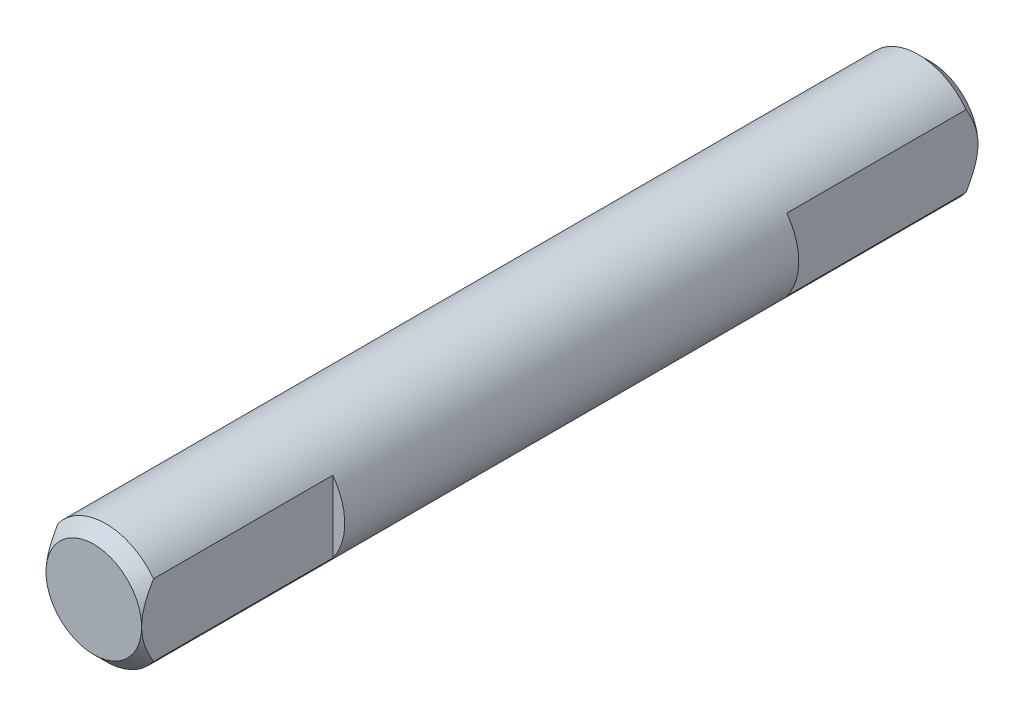
ISO-10303-21;
HEADER;
FILE_DESCRIPTION(('STEP AP214'),'2;1');
FILE_NAME('part.step','',(''),(''),'','','');
FILE_SCHEMA(('AUTOMOTIVE_DESIGN { 1 0 10303 214 1 1 1 1 }'));
ENDSEC;
DATA;
#1=APPLICATION_CONTEXT('core data for automotive mechanical design processes');
#2=APPLICATION_PROTOCOL_DEFINITION('international standard','automotive_design',2000,#1);
#3=PRODUCT_CONTEXT('',#1,'mechanical');
#4=PRODUCT('Part','Part','',(#3));
#5=PRODUCT_RELATED_PRODUCT_CATEGORY('part','',(#4));
#6=PRODUCT_DEFINITION_FORMATION('','',#4);
#7=PRODUCT_DEFINITION_CONTEXT('part definition',#1,'design');
#8=PRODUCT_DEFINITION('design','',#6,#7);
#9=PRODUCT_DEFINITION_SHAPE('','',#8);
#10=(LENGTH_UNIT() NAMED_UNIT(*) SI_UNIT(.MILLI.,.METRE.));
#11=(NAMED_UNIT(*) PLANE_ANGLE_UNIT() SI_UNIT($,.RADIAN.));
#12=(NAMED_UNIT(*) SI_UNIT($,.STERADIAN.) SOLID_ANGLE_UNIT());
#13=UNCERTAINTY_MEASURE_WITH_UNIT(LENGTH_MEASURE(1.E-05),#10,'distance_accuracy_value','');
#14=(GEOMETRIC_REPRESENTATION_CONTEXT(3) GLOBAL_UNCERTAINTY_ASSIGNED_CONTEXT((#13)) GLOBAL_UNIT_ASSIGNED_CONTEXT((#10,
#11,#12)) REPRESENTATION_CONTEXT('',''));
#15=CARTESIAN_POINT('',(0.,0.,0.));
#16=DIRECTION('',(0.,0.,1.));
#17=DIRECTION('',(1.,0.,0.));
#18=AXIS2_PLACEMENT_3D('',#15,#16,#17);
#19=CARTESIAN_POINT('',(0.,0.,35.));
#20=DIRECTION('',(0.,0.,-1.));
#21=DIRECTION('',(-1.,0.,0.));
#22=AXIS2_PLACEMENT_3D('',#19,#20,#21);
#23=CYLINDRICAL_SURFACE('',#22,2.5);
#24=CARTESIAN_POINT('',(0.,0.,34.5));
#25=DIRECTION('',(0.,0.,1.));
#26=DIRECTION('',(1.,0.,0.));
#27=AXIS2_PLACEMENT_3D('',#24,#25,#26);
#28=CIRCLE('',#27,2.5);
#29=CARTESIAN_POINT('',(-2.,1.5,34.5));
#30=VERTEX_POINT('',#29);
#31=CARTESIAN_POINT('',(2.,1.5,34.5));
#32=VERTEX_POINT('',#31);
#33=EDGE_CURVE('E256',#30,#32,#28,.F.);
#34=ORIENTED_EDGE('',*,*,#33,.T.);
#35=DIRECTION('',(0.,0.,-1.));
#36=VECTOR('',#35,1.);
#37=CARTESIAN_POINT('',(2.,1.5,35.));
#38=LINE('',#37,#36);
#39=CARTESIAN_POINT('',(2.,1.5,27.));
#40=VERTEX_POINT('',#39);
#41=EDGE_CURVE('E241',#32,#40,#38,.T.);
#42=ORIENTED_EDGE('',*,*,#41,.T.);
#43=CARTESIAN_POINT('',(0.,0.,27.));
#44=DIRECTION('',(0.,0.,-1.));
#45=DIRECTION('',(-1.,0.,0.));
#46=AXIS2_PLACEMENT_3D('',#43,#44,#45);
#47=CIRCLE('',#46,2.5);
#48=CARTESIAN_POINT('',(2.,-1.5,27.));
#49=VERTEX_POINT('',#48);
#50=EDGE_CURVE('E130',#40,#49,#47,.T.);
#51=ORIENTED_EDGE('',*,*,#50,.T.);
#52=DIRECTION('',(0.,0.,-1.));
#53=VECTOR('',#52,1.);
#54=CARTESIAN_POINT('',(2.,-1.5,35.));
#55=LINE('',#54,#53);
#56=CARTESIAN_POINT('',(2.,-1.5,34.5));
#57=VERTEX_POINT('',#56);
#58=EDGE_CURVE('E270',#49,#57,#55,.F.);
#59=ORIENTED_EDGE('',*,*,#58,.T.);
#60=CARTESIAN_POINT('',(-2.,-1.5,34.5));
#61=VERTEX_POINT('',#60);
#62=EDGE_CURVE('E253',#57,#61,#28,.F.);
#63=ORIENTED_EDGE('',*,*,#62,.T.);
#64=DIRECTION('',(0.,0.,-1.));
#65=VECTOR('',#64,1.);
#66=CARTESIAN_POINT('',(-2.,-1.5,35.));
#67=LINE('',#66,#65);
#68=CARTESIAN_POINT('',(-2.,-1.5,27.));
#69=VERTEX_POINT('',#68);
#70=EDGE_CURVE('E265',#61,#69,#67,.T.);
#71=ORIENTED_EDGE('',*,*,#70,.T.);
#72=CARTESIAN_POINT('',(0.,0.,27.));
#73=DIRECTION('',(0.,0.,1.));
#74=DIRECTION('',(1.,0.,0.));
#75=AXIS2_PLACEMENT_3D('',#72,#73,#74);
#76=CIRCLE('',#75,2.5);
#77=CARTESIAN_POINT('',(-2.,1.5,27.));
#78=VERTEX_POINT('',#77);
#79=EDGE_CURVE('E247',#78,#69,#76,.T.);
#80=ORIENTED_EDGE('',*,*,#79,.F.);
#81=DIRECTION('',(0.,0.,-1.));
#82=VECTOR('',#81,1.);
#83=CARTESIAN_POINT('',(-2.,1.5,35.));
#84=LINE('',#83,#82);
#85=EDGE_CURVE('E259',#78,#30,#84,.F.);
#86=ORIENTED_EDGE('',*,*,#85,.T.);
#87=EDGE_LOOP('',(#34,#42,#51,#59,#63,#71,#80,#86));
#88=FACE_BOUND('',#87,.T.);
#89=DIRECTION('',(0.,0.,-1.));
#90=VECTOR('',#89,1.);
#91=CARTESIAN_POINT('',(2.,-1.5,35.));
#92=LINE('',#91,#90);
#93=CARTESIAN_POINT('',(2.,-1.5,8.));
#94=VERTEX_POINT('',#93);
#95=CARTESIAN_POINT('',(2.,-1.5,0.5));
#96=VERTEX_POINT('',#95);
#97=EDGE_CURVE('E59',#94,#96,#92,.T.);
#98=ORIENTED_EDGE('',*,*,#97,.F.);
#99=CARTESIAN_POINT('',(0.,0.,8.));
#100=DIRECTION('',(0.,0.,1.));
#101=DIRECTION('',(1.,0.,0.));
#102=AXIS2_PLACEMENT_3D('',#99,#100,#101);
#103=CIRCLE('',#102,2.5);
#104=CARTESIAN_POINT('',(2.,1.5,8.));
#105=VERTEX_POINT('',#104);
#106=EDGE_CURVE('E11',#94,#105,#103,.T.);
#107=ORIENTED_EDGE('',*,*,#106,.T.);
#108=DIRECTION('',(0.,0.,-1.));
#109=VECTOR('',#108,1.);
#110=CARTESIAN_POINT('',(2.,1.5,35.));
#111=LINE('',#110,#109);
#112=CARTESIAN_POINT('',(2.,1.5,0.5));
#113=VERTEX_POINT('',#112);
#114=EDGE_CURVE('E286',#113,#105,#111,.F.);
#115=ORIENTED_EDGE('',*,*,#114,.F.);
#116=CARTESIAN_POINT('',(0.,0.,0.5));
#117=DIRECTION('',(0.,0.,1.));
#118=DIRECTION('',(1.,0.,0.));
#119=AXIS2_PLACEMENT_3D('',#116,#117,#118);
#120=CIRCLE('',#119,2.5);
#121=CARTESIAN_POINT('',(-2.,1.5,0.5));
#122=VERTEX_POINT('',#121);
#123=EDGE_CURVE('E149',#113,#122,#120,.T.);
#124=ORIENTED_EDGE('',*,*,#123,.T.);
#125=DIRECTION('',(0.,0.,-1.));
#126=VECTOR('',#125,1.);
#127=CARTESIAN_POINT('',(-2.,1.5,35.));
#128=LINE('',#127,#126);
#129=CARTESIAN_POINT('',(-2.,1.5,8.00000000000001));
#130=VERTEX_POINT('',#129);
#131=EDGE_CURVE('E67',#130,#122,#128,.T.);
#132=ORIENTED_EDGE('',*,*,#131,.F.);
#133=CARTESIAN_POINT('',(0.,0.,8.00000000000001));
#134=DIRECTION('',(0.,0.,-1.));
#135=DIRECTION('',(-1.,0.,0.));
#136=AXIS2_PLACEMENT_3D('',#133,#134,#135);
#137=CIRCLE('',#136,2.5);
#138=CARTESIAN_POINT('',(-2.,-1.5,8.00000000000001));
#139=VERTEX_POINT('',#138);
#140=EDGE_CURVE('E52',#139,#130,#137,.T.);
#141=ORIENTED_EDGE('',*,*,#140,.F.);
#142=DIRECTION('',(0.,0.,-1.));
#143=VECTOR('',#142,1.);
#144=CARTESIAN_POINT('',(-2.,-1.5,35.));
#145=LINE('',#144,#143);
#146=CARTESIAN_POINT('',(-2.,-1.5,0.5));
#147=VERTEX_POINT('',#146);
#148=EDGE_CURVE('E293',#147,#139,#145,.F.);
#149=ORIENTED_EDGE('',*,*,#148,.F.);
#150=EDGE_CURVE('E139',#147,#96,#120,.T.);
#151=ORIENTED_EDGE('',*,*,#150,.T.);
#152=EDGE_LOOP('',(#98,#107,#115,#124,#132,#141,#149,#151));
#153=FACE_BOUND('',#152,.T.);
#154=ADVANCED_FACE('F41',(#88,#153),#23,.T.);
#155=CARTESIAN_POINT('',(0.,0.,0.5));
#156=DIRECTION('',(0.,0.,1.));
#157=DIRECTION('',(1.,0.,0.));
#158=AXIS2_PLACEMENT_3D('',#155,#156,#157);
#159=CONICAL_SURFACE('',#158,2.5,0.78539816339745);
#160=ORIENTED_EDGE('',*,*,#123,.F.);
#161=CARTESIAN_POINT('',(2.,4.70733260334106,3.11458505046867));
#162=CARTESIAN_POINT('',(2.,4.56765633851216,2.98606868600203));
#163=CARTESIAN_POINT('',(2.,4.42757690484636,2.85798377123656));
#164=CARTESIAN_POINT('',(2.,4.14626179218968,2.6030262124796));
#165=CARTESIAN_POINT('',(2.,4.00502585629595,2.47615385219663));
#166=CARTESIAN_POINT('',(2.,3.72024074410302,2.22325670914494));
#167=CARTESIAN_POINT('',(2.,3.5766826930685,2.09724189685756));
#168=CARTESIAN_POINT('',(2.,3.2876237827933,1.84748612790184));
#169=CARTESIAN_POINT('',(2.,3.14212315821885,1.72374490079594));
#170=CARTESIAN_POINT('',(2.,2.87541951246266,1.50194473941931));
#171=CARTESIAN_POINT('',(2.,2.7546665538689,1.40334608469604));
#172=CARTESIAN_POINT('',(2.,2.5107812138698,1.20913757810508));
#173=CARTESIAN_POINT('',(2.,2.38764902812163,1.11352748214988));
#174=CARTESIAN_POINT('',(2.,2.13828133077954,0.926674966919423));
#175=CARTESIAN_POINT('',(2.,2.01204889232086,0.835428467272768));
#176=CARTESIAN_POINT('',(2.,1.75521275694857,0.65931997030913));
#177=CARTESIAN_POINT('',(2.,1.62461146080164,0.574454547118741));
#178=CARTESIAN_POINT('',(2.,1.42478099127702,0.455038928042071));
#179=CARTESIAN_POINT('',(2.,1.35782206346063,0.416700559448546));
#180=CARTESIAN_POINT('',(2.,1.22219748415621,0.343183984293799));
#181=CARTESIAN_POINT('',(2.,1.15353226000204,0.308004996463979));
#182=CARTESIAN_POINT('',(2.,1.01433128796129,0.241679866989011));
#183=CARTESIAN_POINT('',(2.,0.94379709422244,0.210530493914011));
#184=CARTESIAN_POINT('',(2.,0.800682336121673,0.153321987505701));
#185=CARTESIAN_POINT('',(2.,0.728102372303708,0.127261377792704));
#186=CARTESIAN_POINT('',(2.,0.596625866914442,0.0863691186601699));
#187=CARTESIAN_POINT('',(2.,0.53810762757219,0.0703280445681481));
#188=CARTESIAN_POINT('',(2.,0.420010861816682,0.0428205106292761));
#189=CARTESIAN_POINT('',(2.,0.360432708997187,0.0313524710103287));
#190=CARTESIAN_POINT('',(2.,0.2406727801969,0.013561343550777));
#191=CARTESIAN_POINT('',(2.,0.180493164630591,0.00722392253696024));
#192=CARTESIAN_POINT('',(2.,0.0598045119102166,-1.25513709071584E-05));
#193=CARTESIAN_POINT('',(2.,-0.000704513150542348,-0.000911802581740898));
#194=CARTESIAN_POINT('',(2.,-0.12161273889781,0.00278155370624693));
#195=CARTESIAN_POINT('',(2.,-0.182011768594845,0.00737966956486273));
#196=CARTESIAN_POINT('',(2.,-0.302181632573437,0.0218191650052441));
#197=CARTESIAN_POINT('',(2.,-0.361952339006533,0.0316615913959607));
#198=CARTESIAN_POINT('',(2.,-0.480679035525496,0.0561284694837315));
#199=CARTESIAN_POINT('',(2.,-0.539632078312704,0.0707670384292919));
#200=CARTESIAN_POINT('',(2.,-0.656331276144349,0.104197433836032));
#201=CARTESIAN_POINT('',(2.,-0.714077416632477,0.122989310358166));
#202=CARTESIAN_POINT('',(2.,-0.906324430916522,0.192141780557365));
#203=CARTESIAN_POINT('',(2.,-1.03792580460996,0.25056171854498));
#204=CARTESIAN_POINT('',(2.,-1.29483732764872,0.379965644401734));
#205=CARTESIAN_POINT('',(2.,-1.42013296272368,0.450977056029693));
#206=CARTESIAN_POINT('',(2.,-1.66723061798334,0.601924422629116));
#207=CARTESIAN_POINT('',(2.,-1.78897282166976,0.681957080371664));
#208=CARTESIAN_POINT('',(2.,-2.02854158468645,0.847366224214051));
#209=CARTESIAN_POINT('',(2.,-2.14637186137293,0.932737401067285));
#210=CARTESIAN_POINT('',(2.,-2.37274672327691,1.10236096326613));
#211=CARTESIAN_POINT('',(2.,-2.48144337967512,1.18641173372975));
#212=CARTESIAN_POINT('',(2.,-2.69692128751157,1.35694066579446));
#213=CARTESIAN_POINT('',(2.,-2.80370238589713,1.44341901995557));
#214=CARTESIAN_POINT('',(2.,-3.01584325679499,1.61824590362354));
#215=CARTESIAN_POINT('',(2.,-3.12120198346214,1.70659569831334));
#216=CARTESIAN_POINT('',(2.,-3.33073897034599,1.8846849624911));
#217=CARTESIAN_POINT('',(2.,-3.43491720975857,1.97442445640444));
#218=CARTESIAN_POINT('',(2.,-3.63743889300396,2.15073491407193));
#219=CARTESIAN_POINT('',(2.,-3.7358259321047,2.23725588581223));
#220=CARTESIAN_POINT('',(2.,-3.93189567773272,2.41109393862329));
#221=CARTESIAN_POINT('',(2.,-4.02957837541264,2.49841102966317));
#222=CARTESIAN_POINT('',(2.,-4.22421976777858,2.67356715369778));
#223=CARTESIAN_POINT('',(2.,-4.32117930214648,2.76140525460758));
#224=CARTESIAN_POINT('',(2.,-4.51460358612084,2.93761836874425));
#225=CARTESIAN_POINT('',(2.,-4.61106835190253,3.02599336420968));
#226=CARTESIAN_POINT('',(2.,-4.70733260334106,3.11458505046867));
#227=B_SPLINE_CURVE_WITH_KNOTS('',3,(#161,#162,#163,#164,#165,#166,#167,#168,#169,#170,#171,
#172,#173,#174,#175,#176,#177,#178,#179,#180,#181,#182,#183,#184,#185,#186,#187,#188,#189,#190,
#191,#192,#193,#194,#195,#196,#197,#198,#199,#200,#201,#202,#203,#204,#205,#206,#207,#208,#209,
#210,#211,#212,#213,#214,#215,#216,#217,#218,#219,#220,#221,#222,#223,#224,#225,#226),
.UNSPECIFIED.,.F.,.F.,(4,2,2,2,2,2,2,2,2,2,2,2,2,2,2,2,2,2,2,2,2,2,2,2,2,2,2,2,2,2,2,2,4),(0.,
0.569420844434676,1.13897180917573,1.71201586574736,2.28499131295323,2.75264217508894,
3.22025474198279,3.68742113675619,4.15433490125256,4.38574501848536,4.61709775290638,
4.84826379537268,5.07936267071599,5.26123760911258,5.44304966357884,5.62435202816021,
5.80564778104686,5.98712534456105,6.16863914611713,6.35069209947591,6.53274724728849,
6.96347783440279,7.39515832484498,7.83200905240167,8.26843202907216,8.68059475365626,
9.09279026458087,9.50527394347325,9.91776488043138,10.3108157304498,10.7038715090838,
11.0963615782175,11.4888387330146),.UNSPECIFIED.);
#228=CARTESIAN_POINT('',(2.,0.,0.));
#229=VERTEX_POINT('',#228);
#230=EDGE_CURVE('E146',#113,#229,#227,.T.);
#231=ORIENTED_EDGE('',*,*,#230,.T.);
#232=CARTESIAN_POINT('',(0.,0.,0.));
#233=DIRECTION('',(0.,0.,1.));
#234=DIRECTION('',(1.,0.,0.));
#235=AXIS2_PLACEMENT_3D('',#232,#233,#234);
#236=CIRCLE('',#235,2.);
#237=CARTESIAN_POINT('',(-2.,0.,0.));
#238=VERTEX_POINT('',#237);
#239=EDGE_CURVE('E144',#238,#229,#236,.F.);
#240=ORIENTED_EDGE('',*,*,#239,.F.);
#241=CARTESIAN_POINT('',(-2.,-4.70733260334106,3.11458505046867));
#242=CARTESIAN_POINT('',(-2.,-4.56765633851216,2.98606868600203));
#243=CARTESIAN_POINT('',(-2.,-4.42757690484636,2.85798377123656));
#244=CARTESIAN_POINT('',(-2.,-4.14626179218968,2.6030262124796));
#245=CARTESIAN_POINT('',(-2.,-4.00502585629595,2.47615385219664));
#246=CARTESIAN_POINT('',(-2.,-3.72024074410302,2.22325670914494));
#247=CARTESIAN_POINT('',(-2.,-3.5766826930685,2.09724189685756));
#248=CARTESIAN_POINT('',(-2.,-3.2876237827933,1.84748612790185));
#249=CARTESIAN_POINT('',(-2.,-3.14212315821885,1.72374490079594));
#250=CARTESIAN_POINT('',(-2.,-2.87541951246266,1.50194473941931));
#251=CARTESIAN_POINT('',(-2.,-2.7546665538689,1.40334608469604));
#252=CARTESIAN_POINT('',(-2.,-2.5107812138698,1.20913757810508));
#253=CARTESIAN_POINT('',(-2.,-2.38764902812163,1.11352748214988));
#254=CARTESIAN_POINT('',(-2.,-2.13828133077953,0.926674966919422));
#255=CARTESIAN_POINT('',(-2.,-2.01204889232085,0.835428467272767));
#256=CARTESIAN_POINT('',(-2.,-1.75521275694857,0.659319970309129));
#257=CARTESIAN_POINT('',(-2.,-1.62461146080164,0.57445454711874));
#258=CARTESIAN_POINT('',(-2.,-1.42478099127702,0.45503892804207));
#259=CARTESIAN_POINT('',(-2.,-1.35782206346063,0.416700559448545));
#260=CARTESIAN_POINT('',(-2.,-1.22219748415621,0.343183984293798));
#261=CARTESIAN_POINT('',(-2.,-1.15353226000204,0.308004996463978));
#262=CARTESIAN_POINT('',(-2.,-1.01433128796129,0.24167986698901));
#263=CARTESIAN_POINT('',(-2.,-0.943797094222437,0.21053049391401));
#264=CARTESIAN_POINT('',(-2.,-0.80068233612167,0.153321987505701));
#265=CARTESIAN_POINT('',(-2.,-0.728102372303705,0.127261377792703));
#266=CARTESIAN_POINT('',(-2.,-0.596625866914439,0.0863691186601694));
#267=CARTESIAN_POINT('',(-2.,-0.538107627572187,0.0703280445681479));
#268=CARTESIAN_POINT('',(-2.,-0.420010861816679,0.0428205106292759));
#269=CARTESIAN_POINT('',(-2.,-0.360432708997184,0.0313524710103284));
#270=CARTESIAN_POINT('',(-2.,-0.240672780196898,0.0135613435507768));
#271=CARTESIAN_POINT('',(-2.,-0.180493164630589,0.00722392253696026));
#272=CARTESIAN_POINT('',(-2.,-0.0598045119102139,-1.25513709070229E-05));
#273=CARTESIAN_POINT('',(-2.,0.000704513150545025,-0.000911802581740874));
#274=CARTESIAN_POINT('',(-2.,0.121612738897812,0.00278155370624683));
#275=CARTESIAN_POINT('',(-2.,0.182011768594847,0.00737966956486258));
#276=CARTESIAN_POINT('',(-2.,0.302181632573439,0.0218191650052441));
#277=CARTESIAN_POINT('',(-2.,0.361952339006535,0.0316615913959609));
#278=CARTESIAN_POINT('',(-2.,0.480679035525498,0.0561284694837318));
#279=CARTESIAN_POINT('',(-2.,0.539632078312707,0.070767038429292));
#280=CARTESIAN_POINT('',(-2.,0.656331276144351,0.104197433836032));
#281=CARTESIAN_POINT('',(-2.,0.714077416632479,0.122989310358167));
#282=CARTESIAN_POINT('',(-2.,0.906324430916525,0.192141780557365));
#283=CARTESIAN_POINT('',(-2.,1.03792580460996,0.250561718544981));
#284=CARTESIAN_POINT('',(-2.,1.29483732764872,0.379965644401735));
#285=CARTESIAN_POINT('',(-2.,1.42013296272368,0.450977056029694));
#286=CARTESIAN_POINT('',(-2.,1.66723061798334,0.601924422629118));
#287=CARTESIAN_POINT('',(-2.,1.78897282166976,0.681957080371667));
#288=CARTESIAN_POINT('',(-2.,2.02854158468645,0.847366224214054));
#289=CARTESIAN_POINT('',(-2.,2.14637186137294,0.932737401067287));
#290=CARTESIAN_POINT('',(-2.,2.37274672327692,1.10236096326614));
#291=CARTESIAN_POINT('',(-2.,2.48144337967513,1.18641173372975));
#292=CARTESIAN_POINT('',(-2.,2.69692128751157,1.35694066579446));
#293=CARTESIAN_POINT('',(-2.,2.80370238589714,1.44341901995557));
#294=CARTESIAN_POINT('',(-2.,3.015843256795,1.61824590362354));
#295=CARTESIAN_POINT('',(-2.,3.12120198346215,1.70659569831334));
#296=CARTESIAN_POINT('',(-2.,3.330738970346,1.8846849624911));
#297=CARTESIAN_POINT('',(-2.,3.43491720975857,1.97442445640445));
#298=CARTESIAN_POINT('',(-2.,3.63743889300396,2.15073491407193));
#299=CARTESIAN_POINT('',(-2.,3.7358259321047,2.23725588581223));
#300=CARTESIAN_POINT('',(-2.,3.93189567773272,2.41109393862329));
#301=CARTESIAN_POINT('',(-2.,4.02957837541264,2.49841102966317));
#302=CARTESIAN_POINT('',(-2.,4.22421976777858,2.67356715369778));
#303=CARTESIAN_POINT('',(-2.,4.32117930214648,2.76140525460758));
#304=CARTESIAN_POINT('',(-2.,4.51460358612084,2.93761836874425));
#305=CARTESIAN_POINT('',(-2.,4.61106835190253,3.02599336420968));
#306=CARTESIAN_POINT('',(-2.,4.70733260334106,3.11458505046867));
#307=B_SPLINE_CURVE_WITH_KNOTS('',3,(#241,#242,#243,#244,#245,#246,#247,#248,#249,#250,#251,
#252,#253,#254,#255,#256,#257,#258,#259,#260,#261,#262,#263,#264,#265,#266,#267,#268,#269,#270,
#271,#272,#273,#274,#275,#276,#277,#278,#279,#280,#281,#282,#283,#284,#285,#286,#287,#288,#289,
#290,#291,#292,#293,#294,#295,#296,#297,#298,#299,#300,#301,#302,#303,#304,#305,#306),
.UNSPECIFIED.,.F.,.F.,(4,2,2,2,2,2,2,2,2,2,2,2,2,2,2,2,2,2,2,2,2,2,2,2,2,2,2,2,2,2,2,2,4),(0.,
0.569420844434675,1.13897180917573,1.71201586574736,2.28499131295323,2.75264217508894,
3.22025474198279,3.6874211367562,4.15433490125257,4.38574501848537,4.61709775290638,
4.84826379537268,5.07936267071599,5.26123760911258,5.44304966357884,5.62435202816021,
5.80564778104686,5.98712534456105,6.16863914611713,6.35069209947591,6.53274724728849,
6.9634778344028,7.39515832484498,7.83200905240167,8.26843202907217,8.68059475365626,
9.09279026458087,9.50527394347325,9.91776488043139,10.3108157304498,10.7038715090838,
11.0963615782175,11.4888387330146),.UNSPECIFIED.);
#308=EDGE_CURVE('E120',#238,#122,#307,.T.);
#309=ORIENTED_EDGE('',*,*,#308,.T.);
#310=EDGE_LOOP('',(#160,#231,#240,#309));
#311=FACE_BOUND('',#310,.T.);
#312=ADVANCED_FACE('F145',(#311),#159,.T.);
#313=EDGE_CURVE('E137',#229,#238,#236,.F.);
#314=ORIENTED_EDGE('',*,*,#313,.F.);
#315=EDGE_CURVE('E141',#229,#96,#227,.T.);
#316=ORIENTED_EDGE('',*,*,#315,.T.);
#317=ORIENTED_EDGE('',*,*,#150,.F.);
#318=EDGE_CURVE('E123',#147,#238,#307,.T.);
#319=ORIENTED_EDGE('',*,*,#318,.T.);
#320=EDGE_LOOP('',(#314,#316,#317,#319));
#321=FACE_BOUND('',#320,.T.);
#322=ADVANCED_FACE('F135',(#321),#159,.T.);
#323=CARTESIAN_POINT('',(0.,0.,35.));
#324=DIRECTION('',(0.,0.,-1.));
#325=DIRECTION('',(-1.,0.,0.));
#326=AXIS2_PLACEMENT_3D('',#323,#324,#325);
#327=CONICAL_SURFACE('',#326,2.00000000000001,0.785398163397446);
#328=CARTESIAN_POINT('',(2.,4.70733260334106,31.8854149495313));
#329=CARTESIAN_POINT('',(2.,4.56765633851216,32.013931313998));
#330=CARTESIAN_POINT('',(2.,4.42757690484636,32.1420162287634));
#331=CARTESIAN_POINT('',(2.,4.14626179218968,32.3969737875204));
#332=CARTESIAN_POINT('',(2.,4.00502585629595,32.5238461478034));
#333=CARTESIAN_POINT('',(2.,3.72024074410302,32.7767432908551));
#334=CARTESIAN_POINT('',(2.,3.5766826930685,32.9027581031424));
#335=CARTESIAN_POINT('',(2.,3.2876237827933,33.1525138720982));
#336=CARTESIAN_POINT('',(2.,3.14212315821886,33.2762550992041));
#337=CARTESIAN_POINT('',(2.,2.87541951246267,33.4980552605807));
#338=CARTESIAN_POINT('',(2.,2.75466655386891,33.596653915304));
#339=CARTESIAN_POINT('',(2.,2.51078121386981,33.7908624218949));
#340=CARTESIAN_POINT('',(2.,2.38764902812164,33.8864725178501));
#341=CARTESIAN_POINT('',(2.,2.13828133077955,34.0733250330806));
#342=CARTESIAN_POINT('',(2.,2.01204889232088,34.1645715327272));
#343=CARTESIAN_POINT('',(2.,1.7552127569486,34.3406800296909));
#344=CARTESIAN_POINT('',(2.,1.62461146080167,34.4255454528812));
#345=CARTESIAN_POINT('',(2.,1.42478099127705,34.5449610719579));
#346=CARTESIAN_POINT('',(2.,1.35782206346066,34.5832994405514));
#347=CARTESIAN_POINT('',(2.,1.22219748415624,34.6568160157062));
#348=CARTESIAN_POINT('',(2.,1.15353226000207,34.691995003536));
#349=CARTESIAN_POINT('',(2.,1.01433128796132,34.758320133011));
#350=CARTESIAN_POINT('',(2.,0.943797094222464,34.789469506086));
#351=CARTESIAN_POINT('',(2.,0.800682336121697,34.8466780124943));
#352=CARTESIAN_POINT('',(2.,0.728102372303732,34.8727386222073));
#353=CARTESIAN_POINT('',(2.,0.596625866914466,34.9136308813398));
#354=CARTESIAN_POINT('',(2.,0.538107627572214,34.9296719554319));
#355=CARTESIAN_POINT('',(2.,0.420010861816706,34.9571794893707));
#356=CARTESIAN_POINT('',(2.,0.360432708997211,34.9686475289897));
#357=CARTESIAN_POINT('',(2.,0.240672780196924,34.9864386564492));
#358=CARTESIAN_POINT('',(2.,0.180493164630615,34.9927760774631));
#359=CARTESIAN_POINT('',(2.,0.0598045119102405,35.0000125513709));
#360=CARTESIAN_POINT('',(2.,-0.000704513150518109,35.0009118025818));
#361=CARTESIAN_POINT('',(2.,-0.121612738897786,34.9972184462938));
#362=CARTESIAN_POINT('',(2.,-0.182011768594822,34.9926203304352));
#363=CARTESIAN_POINT('',(2.,-0.302181632573415,34.9781808349948));
#364=CARTESIAN_POINT('',(2.,-0.36195233900651,34.9683384086041));
#365=CARTESIAN_POINT('',(2.,-0.480679035525474,34.9438715305163));
#366=CARTESIAN_POINT('',(2.,-0.539632078312683,34.9292329615707));
#367=CARTESIAN_POINT('',(2.,-0.656331276144328,34.895802566164));
#368=CARTESIAN_POINT('',(2.,-0.714077416632455,34.8770106896419));
#369=CARTESIAN_POINT('',(2.,-0.906324430916494,34.8078582194427));
#370=CARTESIAN_POINT('',(2.,-1.03792580460993,34.749438281455));
#371=CARTESIAN_POINT('',(2.,-1.29483732764867,34.6200343555983));
#372=CARTESIAN_POINT('',(2.,-1.42013296272363,34.5490229439703));
#373=CARTESIAN_POINT('',(2.,-1.66723061798329,34.3980755773709));
#374=CARTESIAN_POINT('',(2.,-1.7889728216697,34.3180429196284));
#375=CARTESIAN_POINT('',(2.,-2.02854158468638,34.152633775786));
#376=CARTESIAN_POINT('',(2.,-2.14637186137286,34.0672625989328));
#377=CARTESIAN_POINT('',(2.,-2.37274672327684,33.8976390367339));
#378=CARTESIAN_POINT('',(2.,-2.48144337967505,33.8135882662703));
#379=CARTESIAN_POINT('',(2.,-2.69692128751151,33.6430593342056));
#380=CARTESIAN_POINT('',(2.,-2.80370238589707,33.5565809800445));
#381=CARTESIAN_POINT('',(2.,-3.01584325679494,33.3817540963765));
#382=CARTESIAN_POINT('',(2.,-3.1212019834621,33.2934043016867));
#383=CARTESIAN_POINT('',(2.,-3.33073897034595,33.1153150375089));
#384=CARTESIAN_POINT('',(2.,-3.43491720975854,33.0255755435956));
#385=CARTESIAN_POINT('',(2.,-3.63743889300393,32.8492650859281));
#386=CARTESIAN_POINT('',(2.,-3.73582593210468,32.7627441141878));
#387=CARTESIAN_POINT('',(2.,-3.93189567773271,32.5889060613767));
#388=CARTESIAN_POINT('',(2.,-4.02957837541262,32.5015889703368));
#389=CARTESIAN_POINT('',(2.,-4.22421976777856,32.3264328463022));
#390=CARTESIAN_POINT('',(2.,-4.32117930214647,32.2385947453924));
#391=CARTESIAN_POINT('',(2.,-4.51460358612084,32.0623816312557));
#392=CARTESIAN_POINT('',(2.,-4.61106835190253,31.9740066357903));
#393=CARTESIAN_POINT('',(2.,-4.70733260334106,31.8854149495313));
#394=B_SPLINE_CURVE_WITH_KNOTS('',3,(#328,#329,#330,#331,#332,#333,#334,#335,#336,#337,#338,
#339,#340,#341,#342,#343,#344,#345,#346,#347,#348,#349,#350,#351,#352,#353,#354,#355,#356,#357,
#358,#359,#360,#361,#362,#363,#364,#365,#366,#367,#368,#369,#370,#371,#372,#373,#374,#375,#376,
#377,#378,#379,#380,#381,#382,#383,#384,#385,#386,#387,#388,#389,#390,#391,#392,#393),
.UNSPECIFIED.,.F.,.F.,(4,2,2,2,2,2,2,2,2,2,2,2,2,2,2,2,2,2,2,2,2,2,2,2,2,2,2,2,2,2,2,2,4),(0.,
0.569420844434672,1.13897180917573,1.71201586574736,2.28499131295322,2.75264217508893,
3.22025474198277,3.68742113675617,4.15433490125253,4.38574501848534,4.61709775290636,
4.84826379537266,5.07936267071597,5.26123760911256,5.44304966357882,5.62435202816019,
5.80564778104684,5.98712534456103,6.16863914611711,6.35069209947589,6.53274724728847,
6.96347783440276,7.39515832484493,7.8320090524016,8.26843202907208,8.68059475365618,
9.09279026458081,9.50527394347321,9.91776488043136,10.3108157304498,10.7038715090838,
11.0963615782175,11.4888387330146),.UNSPECIFIED.);
#395=CARTESIAN_POINT('',(2.00000000000001,0.,35.));
#396=VERTEX_POINT('',#395);
#397=EDGE_CURVE('E236',#32,#396,#394,.T.);
#398=ORIENTED_EDGE('',*,*,#397,.F.);
#399=ORIENTED_EDGE('',*,*,#33,.F.);
#400=CARTESIAN_POINT('',(-2.,-4.70733260334106,31.8854149495313));
#401=CARTESIAN_POINT('',(-2.,-4.56765633851216,32.013931313998));
#402=CARTESIAN_POINT('',(-2.,-4.42757690484636,32.1420162287634));
#403=CARTESIAN_POINT('',(-2.,-4.14626179218968,32.3969737875204));
#404=CARTESIAN_POINT('',(-2.,-4.00502585629596,32.5238461478034));
#405=CARTESIAN_POINT('',(-2.,-3.72024074410302,32.776743290855));
#406=CARTESIAN_POINT('',(-2.,-3.57668269306851,32.9027581031424));
#407=CARTESIAN_POINT('',(-2.,-3.28762378279331,33.1525138720982));
#408=CARTESIAN_POINT('',(-2.,-3.14212315821886,33.2762550992041));
#409=CARTESIAN_POINT('',(-2.,-2.87541951246268,33.4980552605807));
#410=CARTESIAN_POINT('',(-2.,-2.75466655386892,33.596653915304));
#411=CARTESIAN_POINT('',(-2.,-2.51078121386982,33.7908624218949));
#412=CARTESIAN_POINT('',(-2.,-2.38764902812165,33.8864725178501));
#413=CARTESIAN_POINT('',(-2.,-2.13828133077956,34.0733250330806));
#414=CARTESIAN_POINT('',(-2.,-2.01204889232089,34.1645715327272));
#415=CARTESIAN_POINT('',(-2.,-1.75521275694861,34.3406800296909));
#416=CARTESIAN_POINT('',(-2.,-1.62461146080168,34.4255454528812));
#417=CARTESIAN_POINT('',(-2.,-1.42478099127707,34.5449610719579));
#418=CARTESIAN_POINT('',(-2.,-1.35782206346067,34.5832994405514));
#419=CARTESIAN_POINT('',(-2.,-1.22219748415625,34.6568160157062));
#420=CARTESIAN_POINT('',(-2.,-1.15353226000208,34.691995003536));
#421=CARTESIAN_POINT('',(-2.,-1.01433128796133,34.758320133011));
#422=CARTESIAN_POINT('',(-2.,-0.943797094222476,34.789469506086));
#423=CARTESIAN_POINT('',(-2.,-0.800682336121707,34.8466780124943));
#424=CARTESIAN_POINT('',(-2.,-0.72810237230374,34.8727386222073));
#425=CARTESIAN_POINT('',(-2.,-0.596625866914473,34.9136308813398));
#426=CARTESIAN_POINT('',(-2.,-0.538107627572222,34.9296719554319));
#427=CARTESIAN_POINT('',(-2.,-0.420010861816714,34.9571794893707));
#428=CARTESIAN_POINT('',(-2.,-0.360432708997219,34.9686475289897));
#429=CARTESIAN_POINT('',(-2.,-0.240672780196932,34.9864386564492));
#430=CARTESIAN_POINT('',(-2.,-0.180493164630623,34.9927760774631));
#431=CARTESIAN_POINT('',(-2.,-0.0598045119102487,35.0000125513709));
#432=CARTESIAN_POINT('',(-2.,0.000704513150510093,35.0009118025818));
#433=CARTESIAN_POINT('',(-2.,0.121612738897777,34.9972184462938));
#434=CARTESIAN_POINT('',(-2.,0.182011768594812,34.9926203304352));
#435=CARTESIAN_POINT('',(-2.,0.302181632573405,34.9781808349948));
#436=CARTESIAN_POINT('',(-2.,0.361952339006502,34.9683384086041));
#437=CARTESIAN_POINT('',(-2.,0.480679035525467,34.9438715305163));
#438=CARTESIAN_POINT('',(-2.,0.539632078312675,34.9292329615707));
#439=CARTESIAN_POINT('',(-2.,0.656331276144319,34.895802566164));
#440=CARTESIAN_POINT('',(-2.,0.714077416632447,34.8770106896418));
#441=CARTESIAN_POINT('',(-2.,0.906324430916487,34.8078582194427));
#442=CARTESIAN_POINT('',(-2.,1.03792580460992,34.7494382814551));
#443=CARTESIAN_POINT('',(-2.,1.29483732764866,34.6200343555983));
#444=CARTESIAN_POINT('',(-2.,1.42013296272362,34.5490229439703));
#445=CARTESIAN_POINT('',(-2.,1.66723061798327,34.3980755773709));
#446=CARTESIAN_POINT('',(-2.,1.78897282166969,34.3180429196284));
#447=CARTESIAN_POINT('',(-2.,2.02854158468636,34.152633775786));
#448=CARTESIAN_POINT('',(-2.,2.14637186137284,34.0672625989328));
#449=CARTESIAN_POINT('',(-2.,2.37274672327682,33.8976390367339));
#450=CARTESIAN_POINT('',(-2.,2.48144337967503,33.8135882662703));
#451=CARTESIAN_POINT('',(-2.,2.69692128751149,33.6430593342056));
#452=CARTESIAN_POINT('',(-2.,2.80370238589705,33.5565809800445));
#453=CARTESIAN_POINT('',(-2.,3.01584325679492,33.3817540963765));
#454=CARTESIAN_POINT('',(-2.,3.12120198346208,33.2934043016867));
#455=CARTESIAN_POINT('',(-2.,3.33073897034594,33.1153150375089));
#456=CARTESIAN_POINT('',(-2.,3.43491720975852,33.0255755435956));
#457=CARTESIAN_POINT('',(-2.,3.63743889300392,32.8492650859281));
#458=CARTESIAN_POINT('',(-2.,3.73582593210466,32.7627441141878));
#459=CARTESIAN_POINT('',(-2.,3.93189567773269,32.5889060613767));
#460=CARTESIAN_POINT('',(-2.,4.02957837541261,32.5015889703369));
#461=CARTESIAN_POINT('',(-2.,4.22421976777855,32.3264328463022));
#462=CARTESIAN_POINT('',(-2.,4.32117930214646,32.2385947453924));
#463=CARTESIAN_POINT('',(-2.,4.51460358612083,32.0623816312557));
#464=CARTESIAN_POINT('',(-2.,4.61106835190252,31.9740066357903));
#465=CARTESIAN_POINT('',(-2.,4.70733260334105,31.8854149495313));
#466=B_SPLINE_CURVE_WITH_KNOTS('',3,(#400,#401,#402,#403,#404,#405,#406,#407,#408,#409,#410,
#411,#412,#413,#414,#415,#416,#417,#418,#419,#420,#421,#422,#423,#424,#425,#426,#427,#428,#429,
#430,#431,#432,#433,#434,#435,#436,#437,#438,#439,#440,#441,#442,#443,#444,#445,#446,#447,#448,
#449,#450,#451,#452,#453,#454,#455,#456,#457,#458,#459,#460,#461,#462,#463,#464,#465),
.UNSPECIFIED.,.F.,.F.,(4,2,2,2,2,2,2,2,2,2,2,2,2,2,2,2,2,2,2,2,2,2,2,2,2,2,2,2,2,2,2,2,4),(0.,
0.569420844434677,1.13897180917573,1.71201586574736,2.28499131295322,2.75264217508893,
3.22025474198277,3.68742113675616,4.15433490125253,4.38574501848533,4.61709775290635,
4.84826379537265,5.07936267071597,5.26123760911256,5.44304966357882,5.62435202816019,
5.80564778104684,5.98712534456102,6.16863914611711,6.35069209947589,6.53274724728847,
6.96347783440276,7.39515832484492,7.83200905240159,8.26843202907206,8.68059475365617,
9.0927902645808,9.50527394347319,9.91776488043135,10.3108157304497,10.7038715090838,
11.0963615782175,11.4888387330146),.UNSPECIFIED.);
#467=CARTESIAN_POINT('',(-2.00000000000001,0.,35.));
#468=VERTEX_POINT('',#467);
#469=EDGE_CURVE('E163',#468,#30,#466,.T.);
#470=ORIENTED_EDGE('',*,*,#469,.F.);
#471=CARTESIAN_POINT('',(0.,0.,35.));
#472=DIRECTION('',(0.,0.,1.));
#473=DIRECTION('',(1.,0.,0.));
#474=AXIS2_PLACEMENT_3D('',#471,#472,#473);
#475=CIRCLE('',#474,2.00000000000001);
#476=EDGE_CURVE('E156',#396,#468,#475,.T.);
#477=ORIENTED_EDGE('',*,*,#476,.F.);
#478=EDGE_LOOP('',(#398,#399,#470,#477));
#479=FACE_BOUND('',#478,.T.);
#480=ADVANCED_FACE('F190',(#479),#327,.T.);
#481=CARTESIAN_POINT('',(0.,0.,35.));
#482=DIRECTION('',(0.,0.,1.));
#483=DIRECTION('',(1.,0.,0.));
#484=AXIS2_PLACEMENT_3D('',#481,#482,#483);
#485=PLANE('',#484);
#486=ORIENTED_EDGE('',*,*,#476,.T.);
#487=EDGE_CURVE('E153',#468,#396,#475,.T.);
#488=ORIENTED_EDGE('',*,*,#487,.T.);
#489=EDGE_LOOP('',(#486,#488));
#490=FACE_BOUND('',#489,.T.);
#491=ADVANCED_FACE('F187',(#490),#485,.T.);
#492=CARTESIAN_POINT('',(0.,0.,0.));
#493=DIRECTION('',(0.,0.,1.));
#494=DIRECTION('',(1.,0.,0.));
#495=AXIS2_PLACEMENT_3D('',#492,#493,#494);
#496=PLANE('',#495);
#497=ORIENTED_EDGE('',*,*,#313,.T.);
#498=ORIENTED_EDGE('',*,*,#239,.T.);
#499=EDGE_LOOP('',(#497,#498));
#500=FACE_BOUND('',#499,.T.);
#501=ADVANCED_FACE('F151',(#500),#496,.F.);
#502=EDGE_CURVE('E172',#396,#57,#394,.T.);
#503=ORIENTED_EDGE('',*,*,#502,.F.);
#504=ORIENTED_EDGE('',*,*,#487,.F.);
#505=EDGE_CURVE('E171',#61,#468,#466,.T.);
#506=ORIENTED_EDGE('',*,*,#505,.F.);
#507=ORIENTED_EDGE('',*,*,#62,.F.);
#508=EDGE_LOOP('',(#503,#504,#506,#507));
#509=FACE_BOUND('',#508,.T.);
#510=ADVANCED_FACE('F44',(#509),#327,.T.);
#511=CARTESIAN_POINT('',(0.,0.,27.));
#512=DIRECTION('',(0.,0.,1.));
#513=DIRECTION('',(1.,0.,0.));
#514=AXIS2_PLACEMENT_3D('',#511,#512,#513);
#515=PLANE('',#514);
#516=ORIENTED_EDGE('',*,*,#79,.T.);
#517=DIRECTION('',(0.,1.,0.));
#518=VECTOR('',#517,1.);
#519=CARTESIAN_POINT('',(-2.,1.55573826921295,27.));
#520=LINE('',#519,#518);
#521=EDGE_CURVE('E273',#69,#78,#520,.T.);
#522=ORIENTED_EDGE('',*,*,#521,.T.);
#523=EDGE_LOOP('',(#516,#522));
#524=FACE_BOUND('',#523,.T.);
#525=ADVANCED_FACE('F185',(#524),#515,.T.);
#526=CARTESIAN_POINT('',(-2.,1.55573826921295,27.));
#527=DIRECTION('',(1.,0.,0.));
#528=DIRECTION('',(0.,1.,0.));
#529=AXIS2_PLACEMENT_3D('',#526,#527,#528);
#530=PLANE('',#529);
#531=ORIENTED_EDGE('',*,*,#505,.T.);
#532=ORIENTED_EDGE('',*,*,#469,.T.);
#533=ORIENTED_EDGE('',*,*,#85,.F.);
#534=ORIENTED_EDGE('',*,*,#521,.F.);
#535=ORIENTED_EDGE('',*,*,#70,.F.);
#536=EDGE_LOOP('',(#531,#532,#533,#534,#535));
#537=FACE_BOUND('',#536,.T.);
#538=ADVANCED_FACE('F179',(#537),#530,.F.);
#539=CARTESIAN_POINT('',(0.,0.,27.));
#540=DIRECTION('',(0.,0.,-1.));
#541=DIRECTION('',(-1.,0.,0.));
#542=AXIS2_PLACEMENT_3D('',#539,#540,#541);
#543=PLANE('',#542);
#544=DIRECTION('',(0.,-1.,0.));
#545=VECTOR('',#544,1.);
#546=CARTESIAN_POINT('',(2.,1.55573826921295,27.));
#547=LINE('',#546,#545);
#548=EDGE_CURVE('E266',#40,#49,#547,.T.);
#549=ORIENTED_EDGE('',*,*,#548,.T.);
#550=ORIENTED_EDGE('',*,*,#50,.F.);
#551=EDGE_LOOP('',(#549,#550));
#552=FACE_BOUND('',#551,.T.);
#553=ADVANCED_FACE('F184',(#552),#543,.F.);
#554=CARTESIAN_POINT('',(2.,1.55573826921295,27.));
#555=DIRECTION('',(-1.,0.,0.));
#556=DIRECTION('',(0.,-1.,0.));
#557=AXIS2_PLACEMENT_3D('',#554,#555,#556);
#558=PLANE('',#557);
#559=ORIENTED_EDGE('',*,*,#397,.T.);
#560=ORIENTED_EDGE('',*,*,#502,.T.);
#561=ORIENTED_EDGE('',*,*,#58,.F.);
#562=ORIENTED_EDGE('',*,*,#548,.F.);
#563=ORIENTED_EDGE('',*,*,#41,.F.);
#564=EDGE_LOOP('',(#559,#560,#561,#562,#563));
#565=FACE_BOUND('',#564,.T.);
#566=ADVANCED_FACE('F223',(#565),#558,.F.);
#567=CARTESIAN_POINT('',(0.,0.,8.00000000000001));
#568=DIRECTION('',(0.,0.,-1.));
#569=DIRECTION('',(1.,0.,0.));
#570=AXIS2_PLACEMENT_3D('',#567,#568,#569);
#571=PLANE('',#570);
#572=ORIENTED_EDGE('',*,*,#140,.T.);
#573=DIRECTION('',(0.,1.,0.));
#574=VECTOR('',#573,1.);
#575=CARTESIAN_POINT('',(-2.,1.55573826921295,8.));
#576=LINE('',#575,#574);
#577=EDGE_CURVE('E299',#139,#130,#576,.T.);
#578=ORIENTED_EDGE('',*,*,#577,.F.);
#579=EDGE_LOOP('',(#572,#578));
#580=FACE_BOUND('',#579,.T.);
#581=ADVANCED_FACE('F221',(#580),#571,.T.);
#582=CARTESIAN_POINT('',(-2.,1.55573826921295,8.));
#583=DIRECTION('',(-1.,0.,0.));
#584=DIRECTION('',(0.,-1.,0.));
#585=AXIS2_PLACEMENT_3D('',#582,#583,#584);
#586=PLANE('',#585);
#587=ORIENTED_EDGE('',*,*,#131,.T.);
#588=ORIENTED_EDGE('',*,*,#308,.F.);
#589=ORIENTED_EDGE('',*,*,#318,.F.);
#590=ORIENTED_EDGE('',*,*,#148,.T.);
#591=ORIENTED_EDGE('',*,*,#577,.T.);
#592=EDGE_LOOP('',(#587,#588,#589,#590,#591));
#593=FACE_BOUND('',#592,.T.);
#594=ADVANCED_FACE('F122',(#593),#586,.T.);
#595=CARTESIAN_POINT('',(0.,0.,8.));
#596=DIRECTION('',(0.,0.,1.));
#597=DIRECTION('',(-1.,0.,0.));
#598=AXIS2_PLACEMENT_3D('',#595,#596,#597);
#599=PLANE('',#598);
#600=DIRECTION('',(0.,-1.,0.));
#601=VECTOR('',#600,1.);
#602=CARTESIAN_POINT('',(2.,1.55573826921295,8.));
#603=LINE('',#602,#601);
#604=EDGE_CURVE('E298',#105,#94,#603,.T.);
#605=ORIENTED_EDGE('',*,*,#604,.F.);
#606=ORIENTED_EDGE('',*,*,#106,.F.);
#607=EDGE_LOOP('',(#605,#606));
#608=FACE_BOUND('',#607,.T.);
#609=ADVANCED_FACE('F220',(#608),#599,.F.);
#610=CARTESIAN_POINT('',(2.,1.55573826921295,8.));
#611=DIRECTION('',(1.,0.,0.));
#612=DIRECTION('',(0.,1.,0.));
#613=AXIS2_PLACEMENT_3D('',#610,#611,#612);
#614=PLANE('',#613);
#615=ORIENTED_EDGE('',*,*,#97,.T.);
#616=ORIENTED_EDGE('',*,*,#315,.F.);
#617=ORIENTED_EDGE('',*,*,#230,.F.);
#618=ORIENTED_EDGE('',*,*,#114,.T.);
#619=ORIENTED_EDGE('',*,*,#604,.T.);
#620=EDGE_LOOP('',(#615,#616,#617,#618,#619));
#621=FACE_BOUND('',#620,.T.);
#622=ADVANCED_FACE('F215',(#621),#614,.T.);
#623=CLOSED_SHELL('',(#154,#312,#322,#480,#491,#501,#510,#525,#538,#553,#566,#581,#594,#609,#622));
#624=MANIFOLD_SOLID_BREP('B2',#623);
#625=ADVANCED_BREP_SHAPE_REPRESENTATION('',(#18,#624),#14);
#626=SHAPE_DEFINITION_REPRESENTATION(#9,#625);
ENDSEC;
END-ISO-10303-21;
